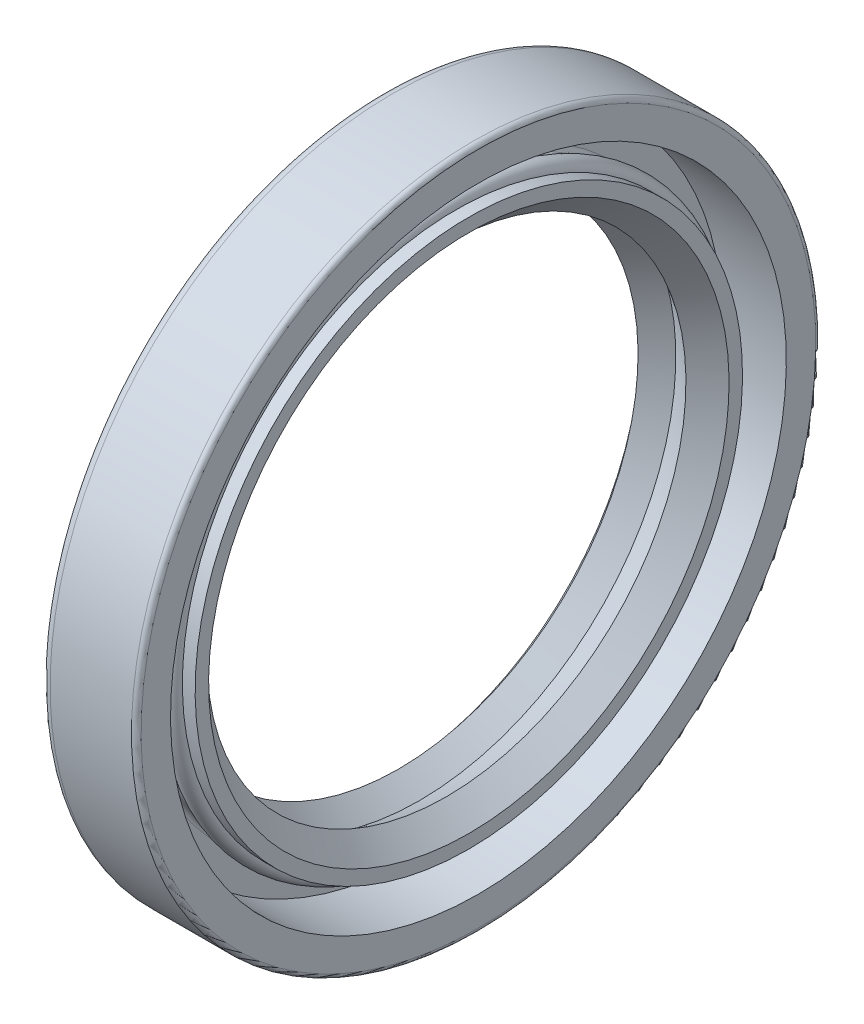
ISO-10303-21;
HEADER;
FILE_DESCRIPTION(('STEP AP214'),'2;1');
FILE_NAME('part.step','',(''),(''),'','','');
FILE_SCHEMA(('AUTOMOTIVE_DESIGN { 1 0 10303 214 1 1 1 1 }'));
ENDSEC;
DATA;
#1=APPLICATION_CONTEXT('core data for automotive mechanical design processes');
#2=APPLICATION_PROTOCOL_DEFINITION('international standard','automotive_design',2000,#1);
#3=PRODUCT_CONTEXT('',#1,'mechanical');
#4=PRODUCT('Part','Part','',(#3));
#5=PRODUCT_RELATED_PRODUCT_CATEGORY('part','',(#4));
#6=PRODUCT_DEFINITION_FORMATION('','',#4);
#7=PRODUCT_DEFINITION_CONTEXT('part definition',#1,'design');
#8=PRODUCT_DEFINITION('design','',#6,#7);
#9=PRODUCT_DEFINITION_SHAPE('','',#8);
#10=(LENGTH_UNIT() NAMED_UNIT(*) SI_UNIT(.MILLI.,.METRE.));
#11=(NAMED_UNIT(*) PLANE_ANGLE_UNIT() SI_UNIT($,.RADIAN.));
#12=(NAMED_UNIT(*) SI_UNIT($,.STERADIAN.) SOLID_ANGLE_UNIT());
#13=UNCERTAINTY_MEASURE_WITH_UNIT(LENGTH_MEASURE(1.E-05),#10,'distance_accuracy_value','');
#14=(GEOMETRIC_REPRESENTATION_CONTEXT(3) GLOBAL_UNCERTAINTY_ASSIGNED_CONTEXT((#13)) GLOBAL_UNIT_ASSIGNED_CONTEXT((#10,
#11,#12)) REPRESENTATION_CONTEXT('',''));
#15=CARTESIAN_POINT('',(0.,0.,0.));
#16=DIRECTION('',(0.,0.,1.));
#17=DIRECTION('',(1.,0.,0.));
#18=AXIS2_PLACEMENT_3D('',#15,#16,#17);
#19=CARTESIAN_POINT('',(4.66666666666667,0.,0.));
#20=DIRECTION('',(-1.,0.,0.));
#21=DIRECTION('',(0.,0.,1.));
#22=AXIS2_PLACEMENT_3D('',#19,#20,#21);
#23=TOROIDAL_SURFACE('',#22,20.,0.699999999999979);
#24=CARTESIAN_POINT('',(4.66666666666667,0.,20.7));
#25=VERTEX_POINT('',#24);
#26=VERTEX_LOOP('',#25);
#27=FACE_BOUND('',#26,.T.);
#28=ADVANCED_FACE('F41',(#27),#23,.T.);
#29=CLOSED_SHELL('',(#28));
#30=MANIFOLD_SOLID_BREP('B2',#29);
#31=CARTESIAN_POINT('',(0.,24.3,0.));
#32=DIRECTION('',(1.,0.,0.));
#33=DIRECTION('',(0.,1.,0.));
#34=AXIS2_PLACEMENT_3D('',#31,#32,#33);
#35=PLANE('',#34);
#36=CARTESIAN_POINT('',(0.,0.,0.));
#37=DIRECTION('',(-1.,0.,0.));
#38=DIRECTION('',(0.,-1.,0.));
#39=AXIS2_PLACEMENT_3D('',#36,#37,#38);
#40=CIRCLE('',#39,22.5);
#41=CARTESIAN_POINT('',(0.,-22.5,0.));
#42=VERTEX_POINT('',#41);
#43=EDGE_CURVE('E40',#42,#42,#40,.T.);
#44=ORIENTED_EDGE('',*,*,#43,.F.);
#45=EDGE_LOOP('',(#44));
#46=FACE_BOUND('',#45,.T.);
#47=CARTESIAN_POINT('',(0.,0.,0.));
#48=DIRECTION('',(-1.,0.,0.));
#49=DIRECTION('',(0.,-1.,0.));
#50=AXIS2_PLACEMENT_3D('',#47,#48,#49);
#51=CIRCLE('',#50,24.3);
#52=CARTESIAN_POINT('',(0.,-24.3,0.));
#53=VERTEX_POINT('',#52);
#54=EDGE_CURVE('E122',#53,#53,#51,.T.);
#55=ORIENTED_EDGE('',*,*,#54,.T.);
#56=EDGE_LOOP('',(#55));
#57=FACE_BOUND('',#56,.T.);
#58=ADVANCED_FACE('F52',(#46,#57),#35,.F.);
#59=CARTESIAN_POINT('',(7.,0.,0.));
#60=DIRECTION('',(-1.,0.,0.));
#61=DIRECTION('',(0.,-1.,0.));
#62=AXIS2_PLACEMENT_3D('',#59,#60,#61);
#63=CYLINDRICAL_SURFACE('',#62,22.5);
#64=CARTESIAN_POINT('',(0.21875,0.,0.));
#65=DIRECTION('',(-1.,0.,0.));
#66=DIRECTION('',(0.,-1.,0.));
#67=AXIS2_PLACEMENT_3D('',#64,#65,#66);
#68=CIRCLE('',#67,22.5);
#69=CARTESIAN_POINT('',(0.21875,-22.5,0.));
#70=VERTEX_POINT('',#69);
#71=EDGE_CURVE('E58',#70,#70,#68,.T.);
#72=ORIENTED_EDGE('',*,*,#71,.F.);
#73=EDGE_LOOP('',(#72));
#74=FACE_BOUND('',#73,.T.);
#75=ORIENTED_EDGE('',*,*,#43,.T.);
#76=EDGE_LOOP('',(#75));
#77=FACE_BOUND('',#76,.T.);
#78=ADVANCED_FACE('F243',(#74,#77),#63,.F.);
#79=CARTESIAN_POINT('',(0.21875,22.5,0.));
#80=DIRECTION('',(1.,0.,0.));
#81=DIRECTION('',(0.,1.,0.));
#82=AXIS2_PLACEMENT_3D('',#79,#80,#81);
#83=PLANE('',#82);
#84=CARTESIAN_POINT('',(0.21875,0.,0.));
#85=DIRECTION('',(-1.,0.,0.));
#86=DIRECTION('',(0.,-1.,0.));
#87=AXIS2_PLACEMENT_3D('',#84,#85,#86);
#88=CIRCLE('',#87,20.);
#89=CARTESIAN_POINT('',(0.21875,-20.,0.));
#90=VERTEX_POINT('',#89);
#91=EDGE_CURVE('E62',#90,#90,#88,.T.);
#92=ORIENTED_EDGE('',*,*,#91,.F.);
#93=EDGE_LOOP('',(#92));
#94=FACE_BOUND('',#93,.T.);
#95=ORIENTED_EDGE('',*,*,#71,.T.);
#96=EDGE_LOOP('',(#95));
#97=FACE_BOUND('',#96,.T.);
#98=ADVANCED_FACE('F238',(#94,#97),#83,.F.);
#99=CARTESIAN_POINT('',(7.,0.,0.));
#100=DIRECTION('',(-1.,0.,0.));
#101=DIRECTION('',(0.,-1.,0.));
#102=AXIS2_PLACEMENT_3D('',#99,#100,#101);
#103=CYLINDRICAL_SURFACE('',#102,20.);
#104=CARTESIAN_POINT('',(0.,0.,0.));
#105=DIRECTION('',(-1.,0.,0.));
#106=DIRECTION('',(0.,-1.,0.));
#107=AXIS2_PLACEMENT_3D('',#104,#105,#106);
#108=CIRCLE('',#107,20.);
#109=CARTESIAN_POINT('',(0.,-20.,0.));
#110=VERTEX_POINT('',#109);
#111=EDGE_CURVE('E66',#110,#110,#108,.T.);
#112=ORIENTED_EDGE('',*,*,#111,.F.);
#113=EDGE_LOOP('',(#112));
#114=FACE_BOUND('',#113,.T.);
#115=ORIENTED_EDGE('',*,*,#91,.T.);
#116=EDGE_LOOP('',(#115));
#117=FACE_BOUND('',#116,.T.);
#118=ADVANCED_FACE('F232',(#114,#117),#103,.T.);
#119=CARTESIAN_POINT('',(0.,20.,0.));
#120=DIRECTION('',(1.,0.,0.));
#121=DIRECTION('',(0.,1.,0.));
#122=AXIS2_PLACEMENT_3D('',#119,#120,#121);
#123=PLANE('',#122);
#124=CARTESIAN_POINT('',(0.,0.,0.));
#125=DIRECTION('',(-1.,0.,0.));
#126=DIRECTION('',(0.,-1.,0.));
#127=AXIS2_PLACEMENT_3D('',#124,#125,#126);
#128=CIRCLE('',#127,19.375);
#129=CARTESIAN_POINT('',(0.,-19.375,0.));
#130=VERTEX_POINT('',#129);
#131=EDGE_CURVE('E71',#130,#130,#128,.T.);
#132=ORIENTED_EDGE('',*,*,#131,.F.);
#133=EDGE_LOOP('',(#132));
#134=FACE_BOUND('',#133,.T.);
#135=ORIENTED_EDGE('',*,*,#111,.T.);
#136=EDGE_LOOP('',(#135));
#137=FACE_BOUND('',#136,.T.);
#138=ADVANCED_FACE('F226',(#134,#137),#123,.F.);
#139=CARTESIAN_POINT('',(0.,0.,0.));
#140=DIRECTION('',(-1.,0.,0.));
#141=DIRECTION('',(0.,-1.,0.));
#142=AXIS2_PLACEMENT_3D('',#139,#140,#141);
#143=CONICAL_SURFACE('',#142,19.375,0.491809175988699);
#144=CARTESIAN_POINT('',(1.16666666666667,0.,0.));
#145=DIRECTION('',(-1.,0.,0.));
#146=DIRECTION('',(0.,-1.,0.));
#147=AXIS2_PLACEMENT_3D('',#144,#145,#146);
#148=CIRCLE('',#147,18.75);
#149=CARTESIAN_POINT('',(1.16666666666667,-18.75,0.));
#150=VERTEX_POINT('',#149);
#151=EDGE_CURVE('E74',#150,#150,#148,.T.);
#152=ORIENTED_EDGE('',*,*,#151,.F.);
#153=EDGE_LOOP('',(#152));
#154=FACE_BOUND('',#153,.T.);
#155=ORIENTED_EDGE('',*,*,#131,.T.);
#156=EDGE_LOOP('',(#155));
#157=FACE_BOUND('',#156,.T.);
#158=ADVANCED_FACE('F220',(#154,#157),#143,.F.);
#159=CARTESIAN_POINT('',(1.16666666666667,0.,0.));
#160=DIRECTION('',(1.,0.,0.));
#161=DIRECTION('',(0.,1.,0.));
#162=AXIS2_PLACEMENT_3D('',#159,#160,#161);
#163=CONICAL_SURFACE('',#162,18.75,0.691239086683906);
#164=CARTESIAN_POINT('',(0.552716368041248,0.,0.));
#165=DIRECTION('',(-1.,0.,0.));
#166=DIRECTION('',(0.,-1.,0.));
#167=AXIS2_PLACEMENT_3D('',#164,#165,#166);
#168=CIRCLE('',#167,18.2420044051212);
#169=CARTESIAN_POINT('',(0.552716368041248,-18.2420044051212,0.));
#170=VERTEX_POINT('',#169);
#171=EDGE_CURVE('E77',#170,#170,#168,.T.);
#172=ORIENTED_EDGE('',*,*,#171,.F.);
#173=EDGE_LOOP('',(#172));
#174=FACE_BOUND('',#173,.T.);
#175=ORIENTED_EDGE('',*,*,#151,.T.);
#176=EDGE_LOOP('',(#175));
#177=FACE_BOUND('',#176,.T.);
#178=ADVANCED_FACE('F214',(#174,#177),#163,.T.);
#179=CARTESIAN_POINT('',(0.552716368041248,0.,0.));
#180=DIRECTION('',(-1.,0.,0.));
#181=DIRECTION('',(0.,-1.,0.));
#182=AXIS2_PLACEMENT_3D('',#179,#180,#181);
#183=CONICAL_SURFACE('',#182,18.2420044051212,0.879557240110992);
#184=CARTESIAN_POINT('',(1.16666666666667,0.,0.));
#185=DIRECTION('',(-1.,0.,0.));
#186=DIRECTION('',(0.,-1.,0.));
#187=AXIS2_PLACEMENT_3D('',#184,#185,#186);
#188=CIRCLE('',#187,17.5);
#189=CARTESIAN_POINT('',(1.16666666666667,-17.5,0.));
#190=VERTEX_POINT('',#189);
#191=EDGE_CURVE('E80',#190,#190,#188,.T.);
#192=ORIENTED_EDGE('',*,*,#191,.F.);
#193=EDGE_LOOP('',(#192));
#194=FACE_BOUND('',#193,.T.);
#195=ORIENTED_EDGE('',*,*,#171,.T.);
#196=EDGE_LOOP('',(#195));
#197=FACE_BOUND('',#196,.T.);
#198=ADVANCED_FACE('F208',(#194,#197),#183,.F.);
#199=CARTESIAN_POINT('',(1.16666666666667,0.,0.));
#200=DIRECTION('',(1.,0.,0.));
#201=DIRECTION('',(0.,1.,0.));
#202=AXIS2_PLACEMENT_3D('',#199,#200,#201);
#203=CONICAL_SURFACE('',#202,17.5,0.691239086683906);
#204=CARTESIAN_POINT('',(2.67738424181578,0.,0.));
#205=DIRECTION('',(-1.,0.,0.));
#206=DIRECTION('',(0.,-1.,0.));
#207=AXIS2_PLACEMENT_3D('',#204,#205,#206);
#208=CIRCLE('',#207,18.75);
#209=CARTESIAN_POINT('',(2.67738424181578,-18.75,0.));
#210=VERTEX_POINT('',#209);
#211=EDGE_CURVE('E83',#210,#210,#208,.T.);
#212=ORIENTED_EDGE('',*,*,#211,.F.);
#213=EDGE_LOOP('',(#212));
#214=FACE_BOUND('',#213,.T.);
#215=ORIENTED_EDGE('',*,*,#191,.T.);
#216=EDGE_LOOP('',(#215));
#217=FACE_BOUND('',#216,.T.);
#218=ADVANCED_FACE('F202',(#214,#217),#203,.F.);
#219=CARTESIAN_POINT('',(2.67738424181578,0.,0.));
#220=DIRECTION('',(-1.,0.,0.));
#221=DIRECTION('',(0.,-1.,0.));
#222=AXIS2_PLACEMENT_3D('',#219,#220,#221);
#223=CONICAL_SURFACE('',#222,18.75,0.561017071351764);
#224=CARTESIAN_POINT('',(4.66666666666667,0.,0.));
#225=DIRECTION('',(-1.,0.,0.));
#226=DIRECTION('',(0.,-1.,0.));
#227=AXIS2_PLACEMENT_3D('',#224,#225,#226);
#228=CIRCLE('',#227,17.5);
#229=CARTESIAN_POINT('',(4.66666666666667,-17.5,0.));
#230=VERTEX_POINT('',#229);
#231=EDGE_CURVE('E86',#230,#230,#228,.T.);
#232=ORIENTED_EDGE('',*,*,#231,.F.);
#233=EDGE_LOOP('',(#232));
#234=FACE_BOUND('',#233,.T.);
#235=ORIENTED_EDGE('',*,*,#211,.T.);
#236=EDGE_LOOP('',(#235));
#237=FACE_BOUND('',#236,.T.);
#238=ADVANCED_FACE('F196',(#234,#237),#223,.F.);
#239=CARTESIAN_POINT('',(4.66666666666667,0.,0.));
#240=DIRECTION('',(1.,0.,0.));
#241=DIRECTION('',(0.,1.,0.));
#242=AXIS2_PLACEMENT_3D('',#239,#240,#241);
#243=CONICAL_SURFACE('',#242,17.5,0.748378047523382);
#244=CARTESIAN_POINT('',(6.3,0.,0.));
#245=DIRECTION('',(-1.,0.,0.));
#246=DIRECTION('',(0.,-1.,0.));
#247=AXIS2_PLACEMENT_3D('',#244,#245,#246);
#248=CIRCLE('',#247,19.0166666666663);
#249=CARTESIAN_POINT('',(6.3,-19.0166666666663,0.));
#250=VERTEX_POINT('',#249);
#251=EDGE_CURVE('E89',#250,#250,#248,.T.);
#252=ORIENTED_EDGE('',*,*,#251,.F.);
#253=EDGE_LOOP('',(#252));
#254=FACE_BOUND('',#253,.T.);
#255=ORIENTED_EDGE('',*,*,#231,.T.);
#256=EDGE_LOOP('',(#255));
#257=FACE_BOUND('',#256,.T.);
#258=ADVANCED_FACE('F190',(#254,#257),#243,.F.);
#259=CARTESIAN_POINT('',(6.3,19.0166666666663,0.));
#260=DIRECTION('',(-1.,0.,0.));
#261=DIRECTION('',(0.,-1.,0.));
#262=AXIS2_PLACEMENT_3D('',#259,#260,#261);
#263=PLANE('',#262);
#264=CARTESIAN_POINT('',(6.3,0.,0.));
#265=DIRECTION('',(-1.,0.,0.));
#266=DIRECTION('',(0.,-1.,0.));
#267=AXIS2_PLACEMENT_3D('',#264,#265,#266);
#268=CIRCLE('',#267,20.);
#269=CARTESIAN_POINT('',(6.3,-20.,0.));
#270=VERTEX_POINT('',#269);
#271=EDGE_CURVE('E92',#270,#270,#268,.T.);
#272=ORIENTED_EDGE('',*,*,#271,.F.);
#273=EDGE_LOOP('',(#272));
#274=FACE_BOUND('',#273,.T.);
#275=ORIENTED_EDGE('',*,*,#251,.T.);
#276=EDGE_LOOP('',(#275));
#277=FACE_BOUND('',#276,.T.);
#278=ADVANCED_FACE('F184',(#274,#277),#263,.F.);
#279=CARTESIAN_POINT('',(7.,0.,0.));
#280=DIRECTION('',(-1.,0.,0.));
#281=DIRECTION('',(0.,-1.,0.));
#282=AXIS2_PLACEMENT_3D('',#279,#280,#281);
#283=CYLINDRICAL_SURFACE('',#282,20.);
#284=CARTESIAN_POINT('',(5.36666666666667,0.,0.));
#285=DIRECTION('',(-1.,0.,0.));
#286=DIRECTION('',(0.,-1.,0.));
#287=AXIS2_PLACEMENT_3D('',#284,#285,#286);
#288=CIRCLE('',#287,20.);
#289=CARTESIAN_POINT('',(5.36666666666667,-20.,0.));
#290=VERTEX_POINT('',#289);
#291=EDGE_CURVE('E95',#290,#290,#288,.T.);
#292=ORIENTED_EDGE('',*,*,#291,.F.);
#293=EDGE_LOOP('',(#292));
#294=FACE_BOUND('',#293,.T.);
#295=ORIENTED_EDGE('',*,*,#271,.T.);
#296=EDGE_LOOP('',(#295));
#297=FACE_BOUND('',#296,.T.);
#298=ADVANCED_FACE('F178',(#294,#297),#283,.T.);
#299=CARTESIAN_POINT('',(4.66666666666667,0.,0.));
#300=DIRECTION('',(-1.,0.,0.));
#301=DIRECTION('',(0.,-1.,0.));
#302=AXIS2_PLACEMENT_3D('',#299,#300,#301);
#303=TOROIDAL_SURFACE('',#302,20.,0.7);
#304=CARTESIAN_POINT('',(3.96666666666667,0.,0.));
#305=DIRECTION('',(-1.,0.,0.));
#306=DIRECTION('',(0.,-1.,0.));
#307=AXIS2_PLACEMENT_3D('',#304,#305,#306);
#308=CIRCLE('',#307,20.);
#309=CARTESIAN_POINT('',(3.96666666666667,-20.,0.));
#310=VERTEX_POINT('',#309);
#311=EDGE_CURVE('E98',#310,#310,#308,.T.);
#312=ORIENTED_EDGE('',*,*,#311,.F.);
#313=EDGE_LOOP('',(#312));
#314=FACE_BOUND('',#313,.T.);
#315=ORIENTED_EDGE('',*,*,#291,.T.);
#316=EDGE_LOOP('',(#315));
#317=FACE_BOUND('',#316,.T.);
#318=ADVANCED_FACE('F172',(#314,#317),#303,.F.);
#319=CARTESIAN_POINT('',(7.,0.,0.));
#320=DIRECTION('',(-1.,0.,0.));
#321=DIRECTION('',(0.,-1.,0.));
#322=AXIS2_PLACEMENT_3D('',#319,#320,#321);
#323=CYLINDRICAL_SURFACE('',#322,20.);
#324=CARTESIAN_POINT('',(2.68333333333333,0.,0.));
#325=DIRECTION('',(-1.,0.,0.));
#326=DIRECTION('',(0.,-1.,0.));
#327=AXIS2_PLACEMENT_3D('',#324,#325,#326);
#328=CIRCLE('',#327,20.);
#329=CARTESIAN_POINT('',(2.68333333333333,-20.,0.));
#330=VERTEX_POINT('',#329);
#331=EDGE_CURVE('E101',#330,#330,#328,.T.);
#332=ORIENTED_EDGE('',*,*,#331,.F.);
#333=EDGE_LOOP('',(#332));
#334=FACE_BOUND('',#333,.T.);
#335=ORIENTED_EDGE('',*,*,#311,.T.);
#336=EDGE_LOOP('',(#335));
#337=FACE_BOUND('',#336,.T.);
#338=ADVANCED_FACE('F166',(#334,#337),#323,.T.);
#339=CARTESIAN_POINT('',(2.68333333333333,0.,0.));
#340=DIRECTION('',(-1.,0.,0.));
#341=DIRECTION('',(0.,-1.,0.));
#342=AXIS2_PLACEMENT_3D('',#339,#340,#341);
#343=TOROIDAL_SURFACE('',#342,20.35,0.350000000000001);
#344=CARTESIAN_POINT('',(2.33333333333333,0.,0.));
#345=DIRECTION('',(-1.,0.,0.));
#346=DIRECTION('',(0.,-1.,0.));
#347=AXIS2_PLACEMENT_3D('',#344,#345,#346);
#348=CIRCLE('',#347,20.35);
#349=CARTESIAN_POINT('',(2.33333333333333,-20.35,0.));
#350=VERTEX_POINT('',#349);
#351=EDGE_CURVE('E104',#350,#350,#348,.T.);
#352=ORIENTED_EDGE('',*,*,#351,.F.);
#353=EDGE_LOOP('',(#352));
#354=FACE_BOUND('',#353,.T.);
#355=ORIENTED_EDGE('',*,*,#331,.T.);
#356=EDGE_LOOP('',(#355));
#357=FACE_BOUND('',#356,.T.);
#358=ADVANCED_FACE('F160',(#354,#357),#343,.F.);
#359=CARTESIAN_POINT('',(2.33333333333333,20.35,0.));
#360=DIRECTION('',(-1.,0.,0.));
#361=DIRECTION('',(0.,-1.,0.));
#362=AXIS2_PLACEMENT_3D('',#359,#360,#361);
#363=PLANE('',#362);
#364=CARTESIAN_POINT('',(2.33333333333333,0.,0.));
#365=DIRECTION('',(-1.,0.,0.));
#366=DIRECTION('',(0.,-1.,0.));
#367=AXIS2_PLACEMENT_3D('',#364,#365,#366);
#368=CIRCLE('',#367,22.5);
#369=CARTESIAN_POINT('',(2.33333333333333,-22.5,0.));
#370=VERTEX_POINT('',#369);
#371=EDGE_CURVE('E107',#370,#370,#368,.T.);
#372=ORIENTED_EDGE('',*,*,#371,.F.);
#373=EDGE_LOOP('',(#372));
#374=FACE_BOUND('',#373,.T.);
#375=ORIENTED_EDGE('',*,*,#351,.T.);
#376=EDGE_LOOP('',(#375));
#377=FACE_BOUND('',#376,.T.);
#378=ADVANCED_FACE('F154',(#374,#377),#363,.F.);
#379=CARTESIAN_POINT('',(7.,0.,0.));
#380=DIRECTION('',(-1.,0.,0.));
#381=DIRECTION('',(0.,-1.,0.));
#382=AXIS2_PLACEMENT_3D('',#379,#380,#381);
#383=CYLINDRICAL_SURFACE('',#382,22.5);
#384=CARTESIAN_POINT('',(7.,0.,0.));
#385=DIRECTION('',(-1.,0.,0.));
#386=DIRECTION('',(0.,-1.,0.));
#387=AXIS2_PLACEMENT_3D('',#384,#385,#386);
#388=CIRCLE('',#387,22.5);
#389=CARTESIAN_POINT('',(7.,-22.5,0.));
#390=VERTEX_POINT('',#389);
#391=EDGE_CURVE('E110',#390,#390,#388,.T.);
#392=ORIENTED_EDGE('',*,*,#391,.F.);
#393=EDGE_LOOP('',(#392));
#394=FACE_BOUND('',#393,.T.);
#395=ORIENTED_EDGE('',*,*,#371,.T.);
#396=EDGE_LOOP('',(#395));
#397=FACE_BOUND('',#396,.T.);
#398=ADVANCED_FACE('F148',(#394,#397),#383,.F.);
#399=CARTESIAN_POINT('',(7.,22.5,0.));
#400=DIRECTION('',(-1.,0.,0.));
#401=DIRECTION('',(0.,-1.,0.));
#402=AXIS2_PLACEMENT_3D('',#399,#400,#401);
#403=PLANE('',#402);
#404=CARTESIAN_POINT('',(7.,0.,0.));
#405=DIRECTION('',(-1.,0.,0.));
#406=DIRECTION('',(0.,-1.,0.));
#407=AXIS2_PLACEMENT_3D('',#404,#405,#406);
#408=CIRCLE('',#407,24.65);
#409=CARTESIAN_POINT('',(7.,-24.65,0.));
#410=VERTEX_POINT('',#409);
#411=EDGE_CURVE('E113',#410,#410,#408,.T.);
#412=ORIENTED_EDGE('',*,*,#411,.F.);
#413=EDGE_LOOP('',(#412));
#414=FACE_BOUND('',#413,.T.);
#415=ORIENTED_EDGE('',*,*,#391,.T.);
#416=EDGE_LOOP('',(#415));
#417=FACE_BOUND('',#416,.T.);
#418=ADVANCED_FACE('F142',(#414,#417),#403,.F.);
#419=CARTESIAN_POINT('',(6.65,0.,0.));
#420=DIRECTION('',(-1.,0.,0.));
#421=DIRECTION('',(0.,-1.,0.));
#422=AXIS2_PLACEMENT_3D('',#419,#420,#421);
#423=TOROIDAL_SURFACE('',#422,24.65,0.350000000000002);
#424=CARTESIAN_POINT('',(6.65,0.,0.));
#425=DIRECTION('',(-1.,0.,0.));
#426=DIRECTION('',(0.,-1.,0.));
#427=AXIS2_PLACEMENT_3D('',#424,#425,#426);
#428=CIRCLE('',#427,25.);
#429=CARTESIAN_POINT('',(6.65,-25.,0.));
#430=VERTEX_POINT('',#429);
#431=EDGE_CURVE('E116',#430,#430,#428,.T.);
#432=ORIENTED_EDGE('',*,*,#431,.F.);
#433=EDGE_LOOP('',(#432));
#434=FACE_BOUND('',#433,.T.);
#435=ORIENTED_EDGE('',*,*,#411,.T.);
#436=EDGE_LOOP('',(#435));
#437=FACE_BOUND('',#436,.T.);
#438=ADVANCED_FACE('F136',(#434,#437),#423,.T.);
#439=CARTESIAN_POINT('',(7.,0.,0.));
#440=DIRECTION('',(-1.,0.,0.));
#441=DIRECTION('',(0.,-1.,0.));
#442=AXIS2_PLACEMENT_3D('',#439,#440,#441);
#443=CYLINDRICAL_SURFACE('',#442,25.);
#444=CARTESIAN_POINT('',(0.699999999999999,0.,0.));
#445=DIRECTION('',(-1.,0.,0.));
#446=DIRECTION('',(0.,-1.,0.));
#447=AXIS2_PLACEMENT_3D('',#444,#445,#446);
#448=CIRCLE('',#447,25.);
#449=CARTESIAN_POINT('',(0.699999999999999,-25.,0.));
#450=VERTEX_POINT('',#449);
#451=EDGE_CURVE('E119',#450,#450,#448,.T.);
#452=ORIENTED_EDGE('',*,*,#451,.F.);
#453=EDGE_LOOP('',(#452));
#454=FACE_BOUND('',#453,.T.);
#455=ORIENTED_EDGE('',*,*,#431,.T.);
#456=EDGE_LOOP('',(#455));
#457=FACE_BOUND('',#456,.T.);
#458=ADVANCED_FACE('F130',(#454,#457),#443,.T.);
#459=CARTESIAN_POINT('',(0.7,0.,0.));
#460=DIRECTION('',(-1.,0.,0.));
#461=DIRECTION('',(0.,-1.,0.));
#462=AXIS2_PLACEMENT_3D('',#459,#460,#461);
#463=TOROIDAL_SURFACE('',#462,24.3,0.699999999999999);
#464=ORIENTED_EDGE('',*,*,#54,.F.);
#465=EDGE_LOOP('',(#464));
#466=FACE_BOUND('',#465,.T.);
#467=ORIENTED_EDGE('',*,*,#451,.T.);
#468=EDGE_LOOP('',(#467));
#469=FACE_BOUND('',#468,.T.);
#470=ADVANCED_FACE('F127',(#466,#469),#463,.T.);
#471=CLOSED_SHELL('',(#58,#78,#98,#118,#138,#158,#178,#198,#218,#238,#258,#278,#298,#318,#338,
#358,#378,#398,#418,#438,#458,#470));
#472=MANIFOLD_SOLID_BREP('B6',#471);
#473=ADVANCED_BREP_SHAPE_REPRESENTATION('',(#18,#30,#472),#14);
#474=SHAPE_DEFINITION_REPRESENTATION(#9,#473);
ENDSEC;
END-ISO-10303-21;
